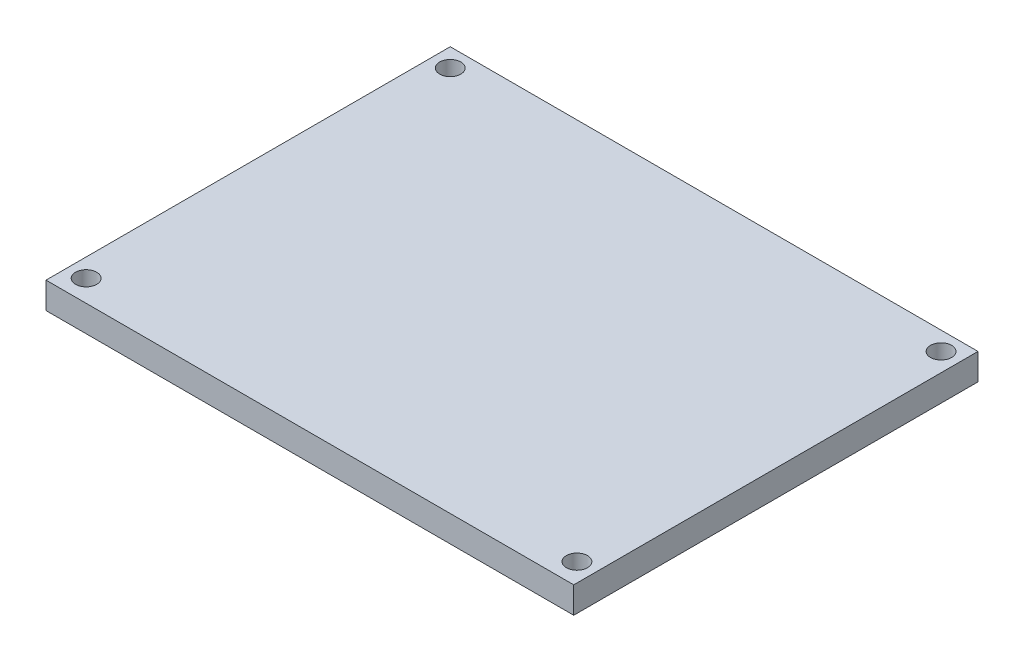
ISO-10303-21;
HEADER;
FILE_DESCRIPTION(('STEP AP214'),'2;1');
FILE_NAME('part.step','',(''),(''),'','','');
FILE_SCHEMA(('AUTOMOTIVE_DESIGN { 1 0 10303 214 1 1 1 1 }'));
ENDSEC;
DATA;
#1=APPLICATION_CONTEXT('core data for automotive mechanical design processes');
#2=APPLICATION_PROTOCOL_DEFINITION('international standard','automotive_design',2000,#1);
#3=PRODUCT_CONTEXT('',#1,'mechanical');
#4=PRODUCT('Part','Part','',(#3));
#5=PRODUCT_RELATED_PRODUCT_CATEGORY('part','',(#4));
#6=PRODUCT_DEFINITION_FORMATION('','',#4);
#7=PRODUCT_DEFINITION_CONTEXT('part definition',#1,'design');
#8=PRODUCT_DEFINITION('design','',#6,#7);
#9=PRODUCT_DEFINITION_SHAPE('','',#8);
#10=(LENGTH_UNIT() NAMED_UNIT(*) SI_UNIT(.MILLI.,.METRE.));
#11=(NAMED_UNIT(*) PLANE_ANGLE_UNIT() SI_UNIT($,.RADIAN.));
#12=(NAMED_UNIT(*) SI_UNIT($,.STERADIAN.) SOLID_ANGLE_UNIT());
#13=UNCERTAINTY_MEASURE_WITH_UNIT(LENGTH_MEASURE(1.E-05),#10,'distance_accuracy_value','');
#14=(GEOMETRIC_REPRESENTATION_CONTEXT(3) GLOBAL_UNCERTAINTY_ASSIGNED_CONTEXT((#13)) GLOBAL_UNIT_ASSIGNED_CONTEXT((#10,
#11,#12)) REPRESENTATION_CONTEXT('',''));
#15=CARTESIAN_POINT('',(0.,0.,0.));
#16=DIRECTION('',(0.,0.,1.));
#17=DIRECTION('',(1.,0.,0.));
#18=AXIS2_PLACEMENT_3D('',#15,#16,#17);
#19=CARTESIAN_POINT('',(-50.,5.,-38.3));
#20=DIRECTION('',(1.,0.,0.));
#21=DIRECTION('',(0.,0.,-1.));
#22=AXIS2_PLACEMENT_3D('',#19,#20,#21);
#23=PLANE('',#22);
#24=DIRECTION('',(0.,0.,1.));
#25=VECTOR('',#24,1.);
#26=CARTESIAN_POINT('',(-50.,0.,-38.3));
#27=LINE('',#26,#25);
#28=CARTESIAN_POINT('',(-50.,0.,-38.3));
#29=VERTEX_POINT('',#28);
#30=CARTESIAN_POINT('',(-50.,0.,38.3));
#31=VERTEX_POINT('',#30);
#32=EDGE_CURVE('E110',#29,#31,#27,.T.);
#33=ORIENTED_EDGE('',*,*,#32,.T.);
#34=DIRECTION('',(0.,-1.,0.));
#35=VECTOR('',#34,1.);
#36=CARTESIAN_POINT('',(-50.,5.,38.3));
#37=LINE('',#36,#35);
#38=CARTESIAN_POINT('',(-50.,5.,38.3));
#39=VERTEX_POINT('',#38);
#40=EDGE_CURVE('E11',#39,#31,#37,.T.);
#41=ORIENTED_EDGE('',*,*,#40,.F.);
#42=DIRECTION('',(0.,0.,1.));
#43=VECTOR('',#42,1.);
#44=CARTESIAN_POINT('',(-50.,5.,-38.3));
#45=LINE('',#44,#43);
#46=CARTESIAN_POINT('',(-50.,5.,-38.3));
#47=VERTEX_POINT('',#46);
#48=EDGE_CURVE('E93',#47,#39,#45,.T.);
#49=ORIENTED_EDGE('',*,*,#48,.F.);
#50=DIRECTION('',(0.,-1.,0.));
#51=VECTOR('',#50,1.);
#52=CARTESIAN_POINT('',(-50.,5.,-38.3));
#53=LINE('',#52,#51);
#54=EDGE_CURVE('E106',#47,#29,#53,.T.);
#55=ORIENTED_EDGE('',*,*,#54,.T.);
#56=EDGE_LOOP('',(#33,#41,#49,#55));
#57=FACE_BOUND('',#56,.T.);
#58=ADVANCED_FACE('F39',(#57),#23,.F.);
#59=CARTESIAN_POINT('',(-50.,5.,38.3));
#60=DIRECTION('',(0.,0.,-1.));
#61=DIRECTION('',(-1.,0.,0.));
#62=AXIS2_PLACEMENT_3D('',#59,#60,#61);
#63=PLANE('',#62);
#64=DIRECTION('',(1.,0.,0.));
#65=VECTOR('',#64,1.);
#66=CARTESIAN_POINT('',(-50.,0.,38.3));
#67=LINE('',#66,#65);
#68=CARTESIAN_POINT('',(50.,0.,38.3));
#69=VERTEX_POINT('',#68);
#70=EDGE_CURVE('E98',#31,#69,#67,.T.);
#71=ORIENTED_EDGE('',*,*,#70,.T.);
#72=DIRECTION('',(0.,-1.,0.));
#73=VECTOR('',#72,1.);
#74=CARTESIAN_POINT('',(50.,5.,38.3));
#75=LINE('',#74,#73);
#76=CARTESIAN_POINT('',(50.,5.,38.3));
#77=VERTEX_POINT('',#76);
#78=EDGE_CURVE('E49',#77,#69,#75,.T.);
#79=ORIENTED_EDGE('',*,*,#78,.F.);
#80=DIRECTION('',(1.,0.,0.));
#81=VECTOR('',#80,1.);
#82=CARTESIAN_POINT('',(-50.,5.,38.3));
#83=LINE('',#82,#81);
#84=EDGE_CURVE('E88',#39,#77,#83,.T.);
#85=ORIENTED_EDGE('',*,*,#84,.F.);
#86=ORIENTED_EDGE('',*,*,#40,.T.);
#87=EDGE_LOOP('',(#71,#79,#85,#86));
#88=FACE_BOUND('',#87,.T.);
#89=ADVANCED_FACE('F97',(#88),#63,.F.);
#90=CARTESIAN_POINT('',(50.,5.,-38.3));
#91=DIRECTION('',(-1.,0.,0.));
#92=DIRECTION('',(0.,0.,1.));
#93=AXIS2_PLACEMENT_3D('',#90,#91,#92);
#94=PLANE('',#93);
#95=DIRECTION('',(0.,0.,-1.));
#96=VECTOR('',#95,1.);
#97=CARTESIAN_POINT('',(50.,0.,-38.3));
#98=LINE('',#97,#96);
#99=CARTESIAN_POINT('',(50.,0.,-38.3));
#100=VERTEX_POINT('',#99);
#101=EDGE_CURVE('E75',#69,#100,#98,.T.);
#102=ORIENTED_EDGE('',*,*,#101,.T.);
#103=DIRECTION('',(0.,-1.,0.));
#104=VECTOR('',#103,1.);
#105=CARTESIAN_POINT('',(50.,5.,-38.3));
#106=LINE('',#105,#104);
#107=CARTESIAN_POINT('',(50.,5.,-38.3));
#108=VERTEX_POINT('',#107);
#109=EDGE_CURVE('E100',#108,#100,#106,.T.);
#110=ORIENTED_EDGE('',*,*,#109,.F.);
#111=DIRECTION('',(0.,0.,-1.));
#112=VECTOR('',#111,1.);
#113=CARTESIAN_POINT('',(50.,5.,-38.3));
#114=LINE('',#113,#112);
#115=EDGE_CURVE('E91',#77,#108,#114,.T.);
#116=ORIENTED_EDGE('',*,*,#115,.F.);
#117=ORIENTED_EDGE('',*,*,#78,.T.);
#118=EDGE_LOOP('',(#102,#110,#116,#117));
#119=FACE_BOUND('',#118,.T.);
#120=ADVANCED_FACE('F102',(#119),#94,.F.);
#121=CARTESIAN_POINT('',(-50.,5.,-38.3));
#122=DIRECTION('',(0.,0.,1.));
#123=DIRECTION('',(1.,0.,0.));
#124=AXIS2_PLACEMENT_3D('',#121,#122,#123);
#125=PLANE('',#124);
#126=DIRECTION('',(-1.,0.,0.));
#127=VECTOR('',#126,1.);
#128=CARTESIAN_POINT('',(-50.,0.,-38.3));
#129=LINE('',#128,#127);
#130=EDGE_CURVE('E81',#100,#29,#129,.T.);
#131=ORIENTED_EDGE('',*,*,#130,.T.);
#132=ORIENTED_EDGE('',*,*,#54,.F.);
#133=DIRECTION('',(-1.,0.,0.));
#134=VECTOR('',#133,1.);
#135=CARTESIAN_POINT('',(-50.,5.,-38.3));
#136=LINE('',#135,#134);
#137=EDGE_CURVE('E58',#108,#47,#136,.T.);
#138=ORIENTED_EDGE('',*,*,#137,.F.);
#139=ORIENTED_EDGE('',*,*,#109,.T.);
#140=EDGE_LOOP('',(#131,#132,#138,#139));
#141=FACE_BOUND('',#140,.T.);
#142=ADVANCED_FACE('F164',(#141),#125,.F.);
#143=CARTESIAN_POINT('',(0.,5.,0.));
#144=DIRECTION('',(0.,1.,0.));
#145=DIRECTION('',(0.,0.,1.));
#146=AXIS2_PLACEMENT_3D('',#143,#144,#145);
#147=PLANE('',#146);
#148=CARTESIAN_POINT('',(-46.5,5.,34.2));
#149=DIRECTION('',(0.,1.,0.));
#150=DIRECTION('',(0.,0.,1.));
#151=AXIS2_PLACEMENT_3D('',#148,#149,#150);
#152=CIRCLE('',#151,2.);
#153=CARTESIAN_POINT('',(-46.5,5.,36.2));
#154=VERTEX_POINT('',#153);
#155=EDGE_CURVE('E135',#154,#154,#152,.T.);
#156=ORIENTED_EDGE('',*,*,#155,.F.);
#157=EDGE_LOOP('',(#156));
#158=FACE_BOUND('',#157,.T.);
#159=CARTESIAN_POINT('',(46.5,5.,34.2));
#160=DIRECTION('',(0.,1.,0.));
#161=DIRECTION('',(0.,0.,1.));
#162=AXIS2_PLACEMENT_3D('',#159,#160,#161);
#163=CIRCLE('',#162,2.);
#164=CARTESIAN_POINT('',(46.5,5.,36.2));
#165=VERTEX_POINT('',#164);
#166=EDGE_CURVE('E143',#165,#165,#163,.T.);
#167=ORIENTED_EDGE('',*,*,#166,.F.);
#168=EDGE_LOOP('',(#167));
#169=FACE_BOUND('',#168,.T.);
#170=CARTESIAN_POINT('',(-46.5,5.,-34.8));
#171=DIRECTION('',(0.,1.,0.));
#172=DIRECTION('',(0.,0.,1.));
#173=AXIS2_PLACEMENT_3D('',#170,#171,#172);
#174=CIRCLE('',#173,2.);
#175=CARTESIAN_POINT('',(-46.5,5.,-32.8));
#176=VERTEX_POINT('',#175);
#177=EDGE_CURVE('E129',#176,#176,#174,.T.);
#178=ORIENTED_EDGE('',*,*,#177,.F.);
#179=EDGE_LOOP('',(#178));
#180=FACE_BOUND('',#179,.T.);
#181=CARTESIAN_POINT('',(46.5,5.,-34.8));
#182=DIRECTION('',(0.,1.,0.));
#183=DIRECTION('',(0.,0.,-1.));
#184=AXIS2_PLACEMENT_3D('',#181,#182,#183);
#185=CIRCLE('',#184,2.);
#186=CARTESIAN_POINT('',(46.5,5.,-36.8));
#187=VERTEX_POINT('',#186);
#188=EDGE_CURVE('E141',#187,#187,#185,.T.);
#189=ORIENTED_EDGE('',*,*,#188,.F.);
#190=EDGE_LOOP('',(#189));
#191=FACE_BOUND('',#190,.T.);
#192=ORIENTED_EDGE('',*,*,#48,.T.);
#193=ORIENTED_EDGE('',*,*,#84,.T.);
#194=ORIENTED_EDGE('',*,*,#115,.T.);
#195=ORIENTED_EDGE('',*,*,#137,.T.);
#196=EDGE_LOOP('',(#192,#193,#194,#195));
#197=FACE_BOUND('',#196,.T.);
#198=ADVANCED_FACE('F89',(#158,#169,#180,#191,#197),#147,.T.);
#199=CARTESIAN_POINT('',(0.,0.,0.));
#200=DIRECTION('',(0.,1.,0.));
#201=DIRECTION('',(0.,0.,1.));
#202=AXIS2_PLACEMENT_3D('',#199,#200,#201);
#203=PLANE('',#202);
#204=CARTESIAN_POINT('',(-46.5,0.,34.2));
#205=DIRECTION('',(0.,1.,0.));
#206=DIRECTION('',(0.,0.,1.));
#207=AXIS2_PLACEMENT_3D('',#204,#205,#206);
#208=CIRCLE('',#207,2.);
#209=CARTESIAN_POINT('',(-46.5,0.,36.2));
#210=VERTEX_POINT('',#209);
#211=EDGE_CURVE('E42',#210,#210,#208,.T.);
#212=ORIENTED_EDGE('',*,*,#211,.T.);
#213=EDGE_LOOP('',(#212));
#214=FACE_BOUND('',#213,.T.);
#215=CARTESIAN_POINT('',(46.5,0.,34.2));
#216=DIRECTION('',(0.,1.,0.));
#217=DIRECTION('',(0.,0.,1.));
#218=AXIS2_PLACEMENT_3D('',#215,#216,#217);
#219=CIRCLE('',#218,2.);
#220=CARTESIAN_POINT('',(46.5,0.,36.2));
#221=VERTEX_POINT('',#220);
#222=EDGE_CURVE('E132',#221,#221,#219,.T.);
#223=ORIENTED_EDGE('',*,*,#222,.T.);
#224=EDGE_LOOP('',(#223));
#225=FACE_BOUND('',#224,.T.);
#226=CARTESIAN_POINT('',(-46.5,0.,-34.8));
#227=DIRECTION('',(0.,1.,0.));
#228=DIRECTION('',(0.,0.,1.));
#229=AXIS2_PLACEMENT_3D('',#226,#227,#228);
#230=CIRCLE('',#229,2.);
#231=CARTESIAN_POINT('',(-46.5,0.,-32.8));
#232=VERTEX_POINT('',#231);
#233=EDGE_CURVE('E114',#232,#232,#230,.T.);
#234=ORIENTED_EDGE('',*,*,#233,.T.);
#235=EDGE_LOOP('',(#234));
#236=FACE_BOUND('',#235,.T.);
#237=CARTESIAN_POINT('',(46.5,0.,-34.8));
#238=DIRECTION('',(0.,1.,0.));
#239=DIRECTION('',(0.,0.,1.));
#240=AXIS2_PLACEMENT_3D('',#237,#238,#239);
#241=CIRCLE('',#240,2.);
#242=CARTESIAN_POINT('',(46.5,0.,-32.8));
#243=VERTEX_POINT('',#242);
#244=EDGE_CURVE('E125',#243,#243,#241,.T.);
#245=ORIENTED_EDGE('',*,*,#244,.T.);
#246=EDGE_LOOP('',(#245));
#247=FACE_BOUND('',#246,.T.);
#248=ORIENTED_EDGE('',*,*,#32,.F.);
#249=ORIENTED_EDGE('',*,*,#130,.F.);
#250=ORIENTED_EDGE('',*,*,#101,.F.);
#251=ORIENTED_EDGE('',*,*,#70,.F.);
#252=EDGE_LOOP('',(#248,#249,#250,#251));
#253=FACE_BOUND('',#252,.T.);
#254=ADVANCED_FACE('F163',(#214,#225,#236,#247,#253),#203,.F.);
#255=CARTESIAN_POINT('',(46.5,-5.,-34.8));
#256=DIRECTION('',(0.,1.,0.));
#257=DIRECTION('',(0.,0.,1.));
#258=AXIS2_PLACEMENT_3D('',#255,#256,#257);
#259=CYLINDRICAL_SURFACE('',#258,2.);
#260=ORIENTED_EDGE('',*,*,#188,.T.);
#261=EDGE_LOOP('',(#260));
#262=FACE_BOUND('',#261,.T.);
#263=ORIENTED_EDGE('',*,*,#244,.F.);
#264=EDGE_LOOP('',(#263));
#265=FACE_BOUND('',#264,.T.);
#266=ADVANCED_FACE('F159',(#262,#265),#259,.F.);
#267=CARTESIAN_POINT('',(-46.5,-5.,-34.8));
#268=DIRECTION('',(0.,1.,0.));
#269=DIRECTION('',(0.,0.,1.));
#270=AXIS2_PLACEMENT_3D('',#267,#268,#269);
#271=CYLINDRICAL_SURFACE('',#270,2.);
#272=ORIENTED_EDGE('',*,*,#177,.T.);
#273=EDGE_LOOP('',(#272));
#274=FACE_BOUND('',#273,.T.);
#275=ORIENTED_EDGE('',*,*,#233,.F.);
#276=EDGE_LOOP('',(#275));
#277=FACE_BOUND('',#276,.T.);
#278=ADVANCED_FACE('F203',(#274,#277),#271,.F.);
#279=CARTESIAN_POINT('',(46.5,-5.,34.2));
#280=DIRECTION('',(0.,1.,0.));
#281=DIRECTION('',(0.,0.,1.));
#282=AXIS2_PLACEMENT_3D('',#279,#280,#281);
#283=CYLINDRICAL_SURFACE('',#282,2.);
#284=ORIENTED_EDGE('',*,*,#166,.T.);
#285=EDGE_LOOP('',(#284));
#286=FACE_BOUND('',#285,.T.);
#287=ORIENTED_EDGE('',*,*,#222,.F.);
#288=EDGE_LOOP('',(#287));
#289=FACE_BOUND('',#288,.T.);
#290=ADVANCED_FACE('F211',(#286,#289),#283,.F.);
#291=CARTESIAN_POINT('',(-46.5,-5.,34.2));
#292=DIRECTION('',(0.,1.,0.));
#293=DIRECTION('',(0.,0.,1.));
#294=AXIS2_PLACEMENT_3D('',#291,#292,#293);
#295=CYLINDRICAL_SURFACE('',#294,2.);
#296=ORIENTED_EDGE('',*,*,#155,.T.);
#297=EDGE_LOOP('',(#296));
#298=FACE_BOUND('',#297,.T.);
#299=ORIENTED_EDGE('',*,*,#211,.F.);
#300=EDGE_LOOP('',(#299));
#301=FACE_BOUND('',#300,.T.);
#302=ADVANCED_FACE('F230',(#298,#301),#295,.F.);
#303=CLOSED_SHELL('',(#58,#89,#120,#142,#198,#254,#266,#278,#290,#302));
#304=MANIFOLD_SOLID_BREP('B2',#303);
#305=ADVANCED_BREP_SHAPE_REPRESENTATION('',(#18,#304),#14);
#306=SHAPE_DEFINITION_REPRESENTATION(#9,#305);
ENDSEC;
END-ISO-10303-21;
